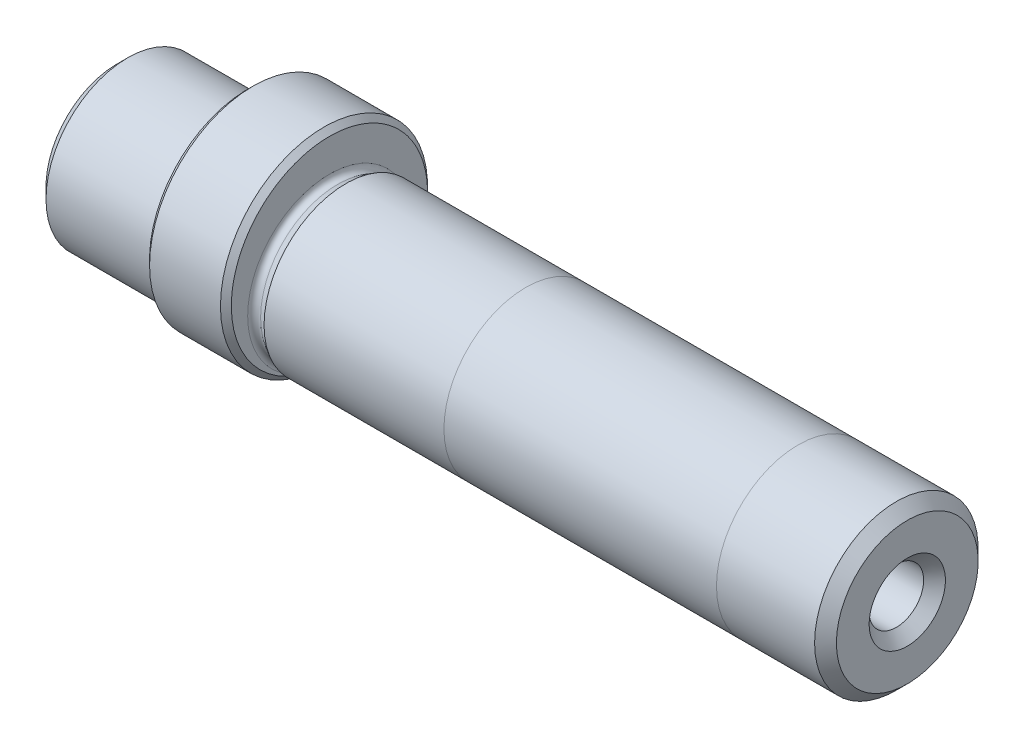
ISO-10303-21;
HEADER;
FILE_DESCRIPTION(('STEP AP214'),'2;1');
FILE_NAME('part.step','',(''),(''),'','','');
FILE_SCHEMA(('AUTOMOTIVE_DESIGN { 1 0 10303 214 1 1 1 1 }'));
ENDSEC;
DATA;
#1=APPLICATION_CONTEXT('core data for automotive mechanical design processes');
#2=APPLICATION_PROTOCOL_DEFINITION('international standard','automotive_design',2000,#1);
#3=PRODUCT_CONTEXT('',#1,'mechanical');
#4=PRODUCT('Part','Part','',(#3));
#5=PRODUCT_RELATED_PRODUCT_CATEGORY('part','',(#4));
#6=PRODUCT_DEFINITION_FORMATION('','',#4);
#7=PRODUCT_DEFINITION_CONTEXT('part definition',#1,'design');
#8=PRODUCT_DEFINITION('design','',#6,#7);
#9=PRODUCT_DEFINITION_SHAPE('','',#8);
#10=(LENGTH_UNIT() NAMED_UNIT(*) SI_UNIT(.MILLI.,.METRE.));
#11=(NAMED_UNIT(*) PLANE_ANGLE_UNIT() SI_UNIT($,.RADIAN.));
#12=(NAMED_UNIT(*) SI_UNIT($,.STERADIAN.) SOLID_ANGLE_UNIT());
#13=UNCERTAINTY_MEASURE_WITH_UNIT(LENGTH_MEASURE(1.E-05),#10,'distance_accuracy_value','');
#14=(GEOMETRIC_REPRESENTATION_CONTEXT(3) GLOBAL_UNCERTAINTY_ASSIGNED_CONTEXT((#13)) GLOBAL_UNIT_ASSIGNED_CONTEXT((#10,
#11,#12)) REPRESENTATION_CONTEXT('',''));
#15=CARTESIAN_POINT('',(0.,0.,0.));
#16=DIRECTION('',(0.,0.,1.));
#17=DIRECTION('',(1.,0.,0.));
#18=AXIS2_PLACEMENT_3D('',#15,#16,#17);
#19=CARTESIAN_POINT('',(0.,0.,0.));
#20=DIRECTION('',(-1.,0.,0.));
#21=DIRECTION('',(0.,0.,0.999999999999999));
#22=AXIS2_PLACEMENT_3D('',#19,#20,#21);
#23=CYLINDRICAL_SURFACE('',#22,15.);
#24=CARTESIAN_POINT('',(75.,0.,0.));
#25=DIRECTION('',(1.,0.,0.));
#26=DIRECTION('',(0.,0.999999999999999,0.));
#27=AXIS2_PLACEMENT_3D('',#24,#25,#26);
#28=CIRCLE('',#27,15.);
#29=CARTESIAN_POINT('',(75.,15.,0.));
#30=VERTEX_POINT('',#29);
#31=EDGE_CURVE('E57',#30,#30,#28,.T.);
#32=ORIENTED_EDGE('',*,*,#31,.T.);
#33=EDGE_LOOP('',(#32));
#34=FACE_BOUND('',#33,.T.);
#35=CARTESIAN_POINT('',(125.,0.,0.));
#36=DIRECTION('',(1.,0.,0.));
#37=DIRECTION('',(0.,0.999999999999999,0.));
#38=AXIS2_PLACEMENT_3D('',#35,#36,#37);
#39=CIRCLE('',#38,15.);
#40=CARTESIAN_POINT('',(125.,15.,0.));
#41=VERTEX_POINT('',#40);
#42=EDGE_CURVE('E12',#41,#41,#39,.T.);
#43=ORIENTED_EDGE('',*,*,#42,.F.);
#44=EDGE_LOOP('',(#43));
#45=FACE_BOUND('',#44,.T.);
#46=ADVANCED_FACE('F47',(#34,#45),#23,.T.);
#47=CARTESIAN_POINT('',(42.,0.,0.));
#48=DIRECTION('',(-1.,0.,0.));
#49=DIRECTION('',(0.,0.,0.999999999999999));
#50=AXIS2_PLACEMENT_3D('',#47,#48,#49);
#51=CIRCLE('',#50,15.);
#52=CARTESIAN_POINT('',(42.,0.,15.));
#53=VERTEX_POINT('',#52);
#54=EDGE_CURVE('E212',#53,#53,#51,.T.);
#55=ORIENTED_EDGE('',*,*,#54,.F.);
#56=EDGE_LOOP('',(#55));
#57=FACE_BOUND('',#56,.T.);
#58=ORIENTED_EDGE('',*,*,#31,.F.);
#59=EDGE_LOOP('',(#58));
#60=FACE_BOUND('',#59,.T.);
#61=ADVANCED_FACE('F120',(#57,#60),#23,.T.);
#62=ORIENTED_EDGE('',*,*,#42,.T.);
#63=EDGE_LOOP('',(#62));
#64=FACE_BOUND('',#63,.T.);
#65=CARTESIAN_POINT('',(143.,0.,0.));
#66=DIRECTION('',(-1.,0.,0.));
#67=DIRECTION('',(0.,0.,0.999999999999999));
#68=AXIS2_PLACEMENT_3D('',#65,#66,#67);
#69=CIRCLE('',#68,15.);
#70=CARTESIAN_POINT('',(143.,0.,15.));
#71=VERTEX_POINT('',#70);
#72=EDGE_CURVE('E76',#71,#71,#69,.T.);
#73=ORIENTED_EDGE('',*,*,#72,.T.);
#74=EDGE_LOOP('',(#73));
#75=FACE_BOUND('',#74,.T.);
#76=ADVANCED_FACE('F122',(#64,#75),#23,.T.);
#77=CARTESIAN_POINT('',(145.,0.,0.));
#78=DIRECTION('',(-1.,0.,0.));
#79=DIRECTION('',(0.,0.,0.999999999999999));
#80=AXIS2_PLACEMENT_3D('',#77,#78,#79);
#81=PLANE('',#80);
#82=CARTESIAN_POINT('',(145.,0.,0.));
#83=DIRECTION('',(-1.,0.,0.));
#84=DIRECTION('',(0.,0.,0.999999999999999));
#85=AXIS2_PLACEMENT_3D('',#82,#83,#84);
#86=CIRCLE('',#85,13.);
#87=CARTESIAN_POINT('',(145.,0.,13.));
#88=VERTEX_POINT('',#87);
#89=EDGE_CURVE('E90',#88,#88,#86,.F.);
#90=ORIENTED_EDGE('',*,*,#89,.T.);
#91=EDGE_LOOP('',(#90));
#92=FACE_BOUND('',#91,.T.);
#93=CARTESIAN_POINT('',(145.,0.,0.));
#94=DIRECTION('',(-1.,0.,0.));
#95=DIRECTION('',(0.,0.,0.999999999999999));
#96=AXIS2_PLACEMENT_3D('',#93,#94,#95);
#97=CIRCLE('',#96,6.99999999999999);
#98=CARTESIAN_POINT('',(145.,0.,6.99999999999998));
#99=VERTEX_POINT('',#98);
#100=EDGE_CURVE('E86',#99,#99,#97,.T.);
#101=ORIENTED_EDGE('',*,*,#100,.T.);
#102=EDGE_LOOP('',(#101));
#103=FACE_BOUND('',#102,.T.);
#104=ADVANCED_FACE('F129',(#92,#103),#81,.F.);
#105=CARTESIAN_POINT('',(40.5,0.,0.));
#106=DIRECTION('',(1.,0.,0.));
#107=DIRECTION('',(0.,0.,-0.999999999999999));
#108=AXIS2_PLACEMENT_3D('',#105,#106,#107);
#109=CONICAL_SURFACE('',#108,14.1339745962155,0.523598775598301);
#110=ORIENTED_EDGE('',*,*,#54,.T.);
#111=EDGE_LOOP('',(#110));
#112=FACE_BOUND('',#111,.T.);
#113=CARTESIAN_POINT('',(40.5,0.,0.));
#114=DIRECTION('',(-1.,0.,0.));
#115=DIRECTION('',(0.,0.,0.999999999999999));
#116=AXIS2_PLACEMENT_3D('',#113,#114,#115);
#117=CIRCLE('',#116,14.1339745962155);
#118=CARTESIAN_POINT('',(40.5,0.,14.1339745962155));
#119=VERTEX_POINT('',#118);
#120=EDGE_CURVE('E208',#119,#119,#117,.T.);
#121=ORIENTED_EDGE('',*,*,#120,.F.);
#122=EDGE_LOOP('',(#121));
#123=FACE_BOUND('',#122,.T.);
#124=ADVANCED_FACE('F138',(#112,#123),#109,.T.);
#125=CARTESIAN_POINT('',(40.,0.,0.));
#126=DIRECTION('',(-1.,0.,0.));
#127=DIRECTION('',(0.,0.,0.999999999999999));
#128=AXIS2_PLACEMENT_3D('',#125,#126,#127);
#129=TOROIDAL_SURFACE('',#128,15.,1.);
#130=ORIENTED_EDGE('',*,*,#120,.T.);
#131=EDGE_LOOP('',(#130));
#132=FACE_BOUND('',#131,.T.);
#133=CARTESIAN_POINT('',(39.,0.,0.));
#134=DIRECTION('',(-1.,0.,0.));
#135=DIRECTION('',(0.,0.,0.999999999999999));
#136=AXIS2_PLACEMENT_3D('',#133,#134,#135);
#137=CIRCLE('',#136,15.);
#138=CARTESIAN_POINT('',(39.,-15.,0.));
#139=VERTEX_POINT('',#138);
#140=EDGE_CURVE('E205',#139,#139,#137,.T.);
#141=ORIENTED_EDGE('',*,*,#140,.F.);
#142=EDGE_LOOP('',(#141));
#143=FACE_BOUND('',#142,.T.);
#144=ADVANCED_FACE('F230',(#132,#143),#129,.F.);
#145=CARTESIAN_POINT('',(39.,15.,0.));
#146=DIRECTION('',(-1.,0.,0.));
#147=DIRECTION('',(0.,0.,0.999999999999999));
#148=AXIS2_PLACEMENT_3D('',#145,#146,#147);
#149=PLANE('',#148);
#150=ORIENTED_EDGE('',*,*,#140,.T.);
#151=CARTESIAN_POINT('',(39.,3.,0.));
#152=DIRECTION('',(-1.,0.,0.));
#153=DIRECTION('',(0.,0.,0.999999999999999));
#154=AXIS2_PLACEMENT_3D('',#151,#152,#153);
#155=CIRCLE('',#154,18.);
#156=EDGE_CURVE('E66',#139,#139,#155,.F.);
#157=ORIENTED_EDGE('',*,*,#156,.T.);
#158=EDGE_LOOP('',(#150,#157));
#159=FACE_BOUND('',#158,.T.);
#160=ADVANCED_FACE('F134',(#159),#149,.F.);
#161=CARTESIAN_POINT('',(24.,25.,0.));
#162=DIRECTION('',(1.,0.,0.));
#163=DIRECTION('',(0.,0.,-0.999999999999999));
#164=AXIS2_PLACEMENT_3D('',#161,#162,#163);
#165=PLANE('',#164);
#166=CARTESIAN_POINT('',(24.,0.,0.));
#167=DIRECTION('',(-1.,0.,0.));
#168=DIRECTION('',(0.,0.,0.999999999999999));
#169=AXIS2_PLACEMENT_3D('',#166,#167,#168);
#170=CIRCLE('',#169,15.);
#171=CARTESIAN_POINT('',(24.,-15.,0.));
#172=VERTEX_POINT('',#171);
#173=EDGE_CURVE('E201',#172,#172,#170,.T.);
#174=ORIENTED_EDGE('',*,*,#173,.F.);
#175=CARTESIAN_POINT('',(24.,3.,0.));
#176=DIRECTION('',(1.,0.,0.));
#177=DIRECTION('',(0.,0.,-0.999999999999999));
#178=AXIS2_PLACEMENT_3D('',#175,#176,#177);
#179=CIRCLE('',#178,18.);
#180=EDGE_CURVE('E62',#172,#172,#179,.F.);
#181=ORIENTED_EDGE('',*,*,#180,.T.);
#182=EDGE_LOOP('',(#174,#181));
#183=FACE_BOUND('',#182,.T.);
#184=ADVANCED_FACE('F222',(#183),#165,.F.);
#185=CARTESIAN_POINT('',(145.,3.,0.));
#186=DIRECTION('',(-1.,0.,0.));
#187=DIRECTION('',(0.,0.,0.999999999999999));
#188=AXIS2_PLACEMENT_3D('',#185,#186,#187);
#189=CYLINDRICAL_SURFACE('',#188,19.);
#190=CARTESIAN_POINT('',(38.,3.,0.));
#191=DIRECTION('',(-1.,0.,0.));
#192=DIRECTION('',(0.,0.,0.999999999999999));
#193=AXIS2_PLACEMENT_3D('',#190,#191,#192);
#194=CIRCLE('',#193,19.);
#195=CARTESIAN_POINT('',(38.,3.,19.));
#196=VERTEX_POINT('',#195);
#197=EDGE_CURVE('E72',#196,#196,#194,.T.);
#198=ORIENTED_EDGE('',*,*,#197,.T.);
#199=EDGE_LOOP('',(#198));
#200=FACE_BOUND('',#199,.T.);
#201=CARTESIAN_POINT('',(25.,3.,0.));
#202=DIRECTION('',(1.,0.,0.));
#203=DIRECTION('',(0.,0.,-0.999999999999999));
#204=AXIS2_PLACEMENT_3D('',#201,#202,#203);
#205=CIRCLE('',#204,19.);
#206=CARTESIAN_POINT('',(25.,3.,-19.));
#207=VERTEX_POINT('',#206);
#208=EDGE_CURVE('E79',#207,#207,#205,.T.);
#209=ORIENTED_EDGE('',*,*,#208,.T.);
#210=EDGE_LOOP('',(#209));
#211=FACE_BOUND('',#210,.T.);
#212=ADVANCED_FACE('F188',(#200,#211),#189,.T.);
#213=CARTESIAN_POINT('',(0.,0.,0.));
#214=DIRECTION('',(-1.,0.,0.));
#215=DIRECTION('',(0.,0.,0.999999999999999));
#216=AXIS2_PLACEMENT_3D('',#213,#214,#215);
#217=CYLINDRICAL_SURFACE('',#216,15.);
#218=CARTESIAN_POINT('',(2.00000000000001,0.,0.));
#219=DIRECTION('',(1.,0.,0.));
#220=DIRECTION('',(0.,0.,-0.999999999999999));
#221=AXIS2_PLACEMENT_3D('',#218,#219,#220);
#222=CIRCLE('',#221,15.);
#223=CARTESIAN_POINT('',(2.00000000000001,0.,-15.));
#224=VERTEX_POINT('',#223);
#225=EDGE_CURVE('E102',#224,#224,#222,.T.);
#226=ORIENTED_EDGE('',*,*,#225,.T.);
#227=EDGE_LOOP('',(#226));
#228=FACE_BOUND('',#227,.T.);
#229=CARTESIAN_POINT('',(21.,0.,0.));
#230=DIRECTION('',(-1.,0.,0.));
#231=DIRECTION('',(0.,0.,0.999999999999999));
#232=AXIS2_PLACEMENT_3D('',#229,#230,#231);
#233=CIRCLE('',#232,15.);
#234=CARTESIAN_POINT('',(21.,0.,15.));
#235=VERTEX_POINT('',#234);
#236=EDGE_CURVE('E192',#235,#235,#233,.T.);
#237=ORIENTED_EDGE('',*,*,#236,.T.);
#238=EDGE_LOOP('',(#237));
#239=FACE_BOUND('',#238,.T.);
#240=ADVANCED_FACE('F184',(#228,#239),#217,.T.);
#241=CARTESIAN_POINT('',(21.,0.,0.));
#242=DIRECTION('',(-1.,0.,0.));
#243=DIRECTION('',(0.,0.,0.999999999999999));
#244=AXIS2_PLACEMENT_3D('',#241,#242,#243);
#245=CONICAL_SURFACE('',#244,15.,0.5235987755983);
#246=CARTESIAN_POINT('',(22.5,0.,0.));
#247=DIRECTION('',(-1.,0.,0.));
#248=DIRECTION('',(0.,0.,0.999999999999999));
#249=AXIS2_PLACEMENT_3D('',#246,#247,#248);
#250=CIRCLE('',#249,14.1339745962156);
#251=CARTESIAN_POINT('',(22.5,0.,14.1339745962155));
#252=VERTEX_POINT('',#251);
#253=EDGE_CURVE('E195',#252,#252,#250,.T.);
#254=ORIENTED_EDGE('',*,*,#253,.T.);
#255=EDGE_LOOP('',(#254));
#256=FACE_BOUND('',#255,.T.);
#257=ORIENTED_EDGE('',*,*,#236,.F.);
#258=EDGE_LOOP('',(#257));
#259=FACE_BOUND('',#258,.T.);
#260=ADVANCED_FACE('F187',(#256,#259),#245,.T.);
#261=CARTESIAN_POINT('',(23.,0.,0.));
#262=DIRECTION('',(-1.,0.,0.));
#263=DIRECTION('',(0.,0.,0.999999999999999));
#264=AXIS2_PLACEMENT_3D('',#261,#262,#263);
#265=TOROIDAL_SURFACE('',#264,15.,1.);
#266=ORIENTED_EDGE('',*,*,#173,.T.);
#267=EDGE_LOOP('',(#266));
#268=FACE_BOUND('',#267,.T.);
#269=ORIENTED_EDGE('',*,*,#253,.F.);
#270=EDGE_LOOP('',(#269));
#271=FACE_BOUND('',#270,.T.);
#272=ADVANCED_FACE('F143',(#268,#271),#265,.F.);
#273=CARTESIAN_POINT('',(0.,15.2,0.));
#274=DIRECTION('',(1.,0.,0.));
#275=DIRECTION('',(0.,0.,-0.999999999999999));
#276=AXIS2_PLACEMENT_3D('',#273,#274,#275);
#277=PLANE('',#276);
#278=CARTESIAN_POINT('',(0.,0.,0.));
#279=DIRECTION('',(1.,0.,0.));
#280=DIRECTION('',(0.,0.,-0.999999999999999));
#281=AXIS2_PLACEMENT_3D('',#278,#279,#280);
#282=CIRCLE('',#281,13.);
#283=CARTESIAN_POINT('',(0.,0.,-13.));
#284=VERTEX_POINT('',#283);
#285=EDGE_CURVE('E110',#284,#284,#282,.F.);
#286=ORIENTED_EDGE('',*,*,#285,.T.);
#287=EDGE_LOOP('',(#286));
#288=FACE_BOUND('',#287,.T.);
#289=CARTESIAN_POINT('',(0.,0.,0.));
#290=DIRECTION('',(1.,0.,0.));
#291=DIRECTION('',(0.,0.,-0.999999999999999));
#292=AXIS2_PLACEMENT_3D('',#289,#290,#291);
#293=CIRCLE('',#292,7.00000000000001);
#294=CARTESIAN_POINT('',(0.,0.,-7.));
#295=VERTEX_POINT('',#294);
#296=EDGE_CURVE('E106',#295,#295,#293,.T.);
#297=ORIENTED_EDGE('',*,*,#296,.T.);
#298=EDGE_LOOP('',(#297));
#299=FACE_BOUND('',#298,.T.);
#300=ADVANCED_FACE('F140',(#288,#299),#277,.F.);
#301=CARTESIAN_POINT('',(38.,3.,0.));
#302=DIRECTION('',(-1.,0.,0.));
#303=DIRECTION('',(0.,0.,0.999999999999999));
#304=AXIS2_PLACEMENT_3D('',#301,#302,#303);
#305=CONICAL_SURFACE('',#304,19.,0.785398163397447);
#306=ORIENTED_EDGE('',*,*,#156,.F.);
#307=EDGE_LOOP('',(#306));
#308=FACE_BOUND('',#307,.T.);
#309=ORIENTED_EDGE('',*,*,#197,.F.);
#310=EDGE_LOOP('',(#309));
#311=FACE_BOUND('',#310,.T.);
#312=ADVANCED_FACE('F67',(#308,#311),#305,.T.);
#313=CARTESIAN_POINT('',(25.,3.,0.));
#314=DIRECTION('',(1.,0.,0.));
#315=DIRECTION('',(0.,0.,-0.999999999999999));
#316=AXIS2_PLACEMENT_3D('',#313,#314,#315);
#317=CONICAL_SURFACE('',#316,19.,0.785398163397453);
#318=ORIENTED_EDGE('',*,*,#180,.F.);
#319=EDGE_LOOP('',(#318));
#320=FACE_BOUND('',#319,.T.);
#321=ORIENTED_EDGE('',*,*,#208,.F.);
#322=EDGE_LOOP('',(#321));
#323=FACE_BOUND('',#322,.T.);
#324=ADVANCED_FACE('F151',(#320,#323),#317,.T.);
#325=CARTESIAN_POINT('',(145.,0.,0.));
#326=DIRECTION('',(-1.,0.,0.));
#327=DIRECTION('',(0.,0.,0.999999999999999));
#328=AXIS2_PLACEMENT_3D('',#325,#326,#327);
#329=CYLINDRICAL_SURFACE('',#328,5.);
#330=CARTESIAN_POINT('',(143.,0.,0.));
#331=DIRECTION('',(-1.,0.,0.));
#332=DIRECTION('',(0.,0.,0.999999999999999));
#333=AXIS2_PLACEMENT_3D('',#330,#331,#332);
#334=CIRCLE('',#333,5.);
#335=CARTESIAN_POINT('',(143.,0.,4.99999999999999));
#336=VERTEX_POINT('',#335);
#337=EDGE_CURVE('E98',#336,#336,#334,.F.);
#338=ORIENTED_EDGE('',*,*,#337,.T.);
#339=EDGE_LOOP('',(#338));
#340=FACE_BOUND('',#339,.T.);
#341=CARTESIAN_POINT('',(2.,0.,0.));
#342=DIRECTION('',(1.,0.,0.));
#343=DIRECTION('',(0.,0.,-0.999999999999999));
#344=AXIS2_PLACEMENT_3D('',#341,#342,#343);
#345=CIRCLE('',#344,5.);
#346=CARTESIAN_POINT('',(2.,0.,-4.99999999999999));
#347=VERTEX_POINT('',#346);
#348=EDGE_CURVE('E94',#347,#347,#345,.F.);
#349=ORIENTED_EDGE('',*,*,#348,.T.);
#350=EDGE_LOOP('',(#349));
#351=FACE_BOUND('',#350,.T.);
#352=ADVANCED_FACE('F157',(#340,#351),#329,.F.);
#353=CARTESIAN_POINT('',(143.,0.,0.));
#354=DIRECTION('',(-1.,0.,0.));
#355=DIRECTION('',(0.,0.,0.999999999999999));
#356=AXIS2_PLACEMENT_3D('',#353,#354,#355);
#357=CONICAL_SURFACE('',#356,15.,0.785398163397457);
#358=ORIENTED_EDGE('',*,*,#89,.F.);
#359=EDGE_LOOP('',(#358));
#360=FACE_BOUND('',#359,.T.);
#361=ORIENTED_EDGE('',*,*,#72,.F.);
#362=EDGE_LOOP('',(#361));
#363=FACE_BOUND('',#362,.T.);
#364=ADVANCED_FACE('F158',(#360,#363),#357,.T.);
#365=CARTESIAN_POINT('',(145.,0.,0.));
#366=DIRECTION('',(1.,0.,0.));
#367=DIRECTION('',(0.,0.,-0.999999999999999));
#368=AXIS2_PLACEMENT_3D('',#365,#366,#367);
#369=CONICAL_SURFACE('',#368,6.99999999999999,0.785398163397446);
#370=ORIENTED_EDGE('',*,*,#337,.F.);
#371=EDGE_LOOP('',(#370));
#372=FACE_BOUND('',#371,.T.);
#373=ORIENTED_EDGE('',*,*,#100,.F.);
#374=EDGE_LOOP('',(#373));
#375=FACE_BOUND('',#374,.T.);
#376=ADVANCED_FACE('F164',(#372,#375),#369,.F.);
#377=CARTESIAN_POINT('',(2.00000000000001,0.,0.));
#378=DIRECTION('',(1.,0.,0.));
#379=DIRECTION('',(0.,0.,-0.999999999999999));
#380=AXIS2_PLACEMENT_3D('',#377,#378,#379);
#381=CONICAL_SURFACE('',#380,15.,0.785398163397451);
#382=ORIENTED_EDGE('',*,*,#285,.F.);
#383=EDGE_LOOP('',(#382));
#384=FACE_BOUND('',#383,.T.);
#385=ORIENTED_EDGE('',*,*,#225,.F.);
#386=EDGE_LOOP('',(#385));
#387=FACE_BOUND('',#386,.T.);
#388=ADVANCED_FACE('F170',(#384,#387),#381,.T.);
#389=CARTESIAN_POINT('',(2.,0.,0.));
#390=DIRECTION('',(-1.,0.,0.));
#391=DIRECTION('',(0.,0.,0.999999999999999));
#392=AXIS2_PLACEMENT_3D('',#389,#390,#391);
#393=CONICAL_SURFACE('',#392,5.,0.785398163397449);
#394=ORIENTED_EDGE('',*,*,#296,.F.);
#395=EDGE_LOOP('',(#394));
#396=FACE_BOUND('',#395,.T.);
#397=ORIENTED_EDGE('',*,*,#348,.F.);
#398=EDGE_LOOP('',(#397));
#399=FACE_BOUND('',#398,.T.);
#400=ADVANCED_FACE('F50',(#396,#399),#393,.F.);
#401=CLOSED_SHELL('',(#46,#61,#76,#104,#124,#144,#160,#184,#212,#240,#260,#272,#300,#312,#324,
#352,#364,#376,#388,#400));
#402=MANIFOLD_SOLID_BREP('B2',#401);
#403=ADVANCED_BREP_SHAPE_REPRESENTATION('',(#18,#402),#14);
#404=SHAPE_DEFINITION_REPRESENTATION(#9,#403);
ENDSEC;
END-ISO-10303-21;
